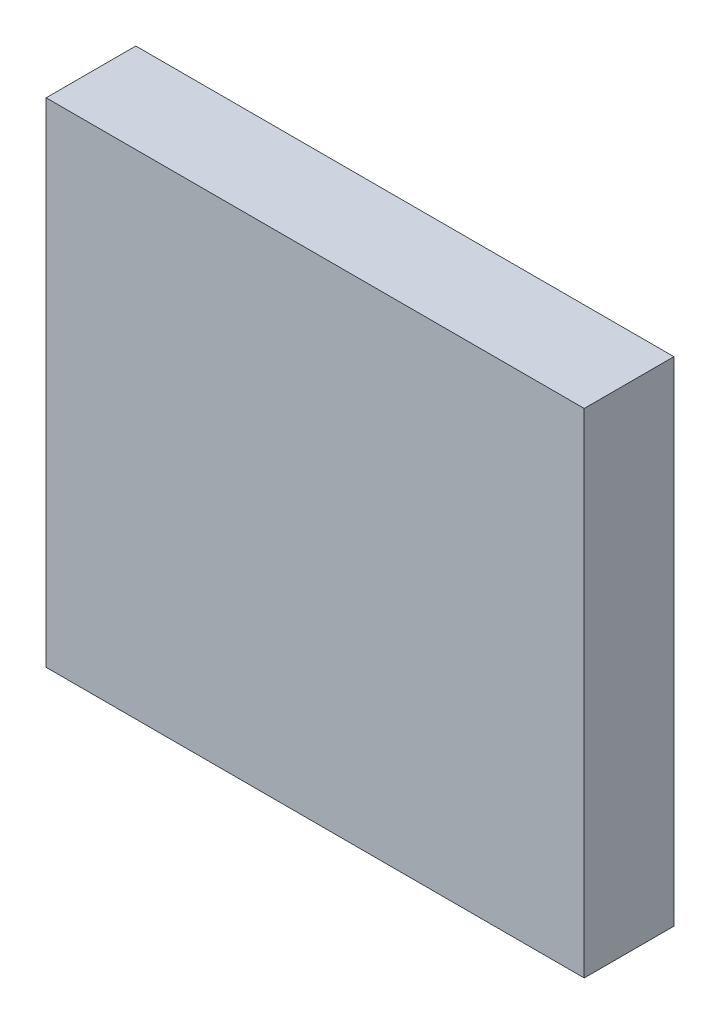
ISO-10303-21;
HEADER;
FILE_DESCRIPTION(('STEP AP214'),'2;1');
FILE_NAME('part.step','',(''),(''),'','','');
FILE_SCHEMA(('AUTOMOTIVE_DESIGN { 1 0 10303 214 1 1 1 1 }'));
ENDSEC;
DATA;
#1=APPLICATION_CONTEXT('core data for automotive mechanical design processes');
#2=APPLICATION_PROTOCOL_DEFINITION('international standard','automotive_design',2000,#1);
#3=PRODUCT_CONTEXT('',#1,'mechanical');
#4=PRODUCT('Part','Part','',(#3));
#5=PRODUCT_RELATED_PRODUCT_CATEGORY('part','',(#4));
#6=PRODUCT_DEFINITION_FORMATION('','',#4);
#7=PRODUCT_DEFINITION_CONTEXT('part definition',#1,'design');
#8=PRODUCT_DEFINITION('design','',#6,#7);
#9=PRODUCT_DEFINITION_SHAPE('','',#8);
#10=(LENGTH_UNIT() NAMED_UNIT(*) SI_UNIT(.MILLI.,.METRE.));
#11=(NAMED_UNIT(*) PLANE_ANGLE_UNIT() SI_UNIT($,.RADIAN.));
#12=(NAMED_UNIT(*) SI_UNIT($,.STERADIAN.) SOLID_ANGLE_UNIT());
#13=UNCERTAINTY_MEASURE_WITH_UNIT(LENGTH_MEASURE(1.E-05),#10,'distance_accuracy_value','');
#14=(GEOMETRIC_REPRESENTATION_CONTEXT(3) GLOBAL_UNCERTAINTY_ASSIGNED_CONTEXT((#13)) GLOBAL_UNIT_ASSIGNED_CONTEXT((#10,
#11,#12)) REPRESENTATION_CONTEXT('',''));
#15=CARTESIAN_POINT('',(0.,0.,0.));
#16=DIRECTION('',(0.,0.,1.));
#17=DIRECTION('',(1.,0.,0.));
#18=AXIS2_PLACEMENT_3D('',#15,#16,#17);
#19=CARTESIAN_POINT('',(-15.,13.75,5.));
#20=DIRECTION('',(1.,0.,0.));
#21=DIRECTION('',(0.,1.,0.));
#22=AXIS2_PLACEMENT_3D('',#19,#20,#21);
#23=PLANE('',#22);
#24=DIRECTION('',(0.,-1.,0.));
#25=VECTOR('',#24,1.);
#26=CARTESIAN_POINT('',(-15.,13.75,0.));
#27=LINE('',#26,#25);
#28=CARTESIAN_POINT('',(-15.,13.75,0.));
#29=VERTEX_POINT('',#28);
#30=CARTESIAN_POINT('',(-15.,-13.75,0.));
#31=VERTEX_POINT('',#30);
#32=EDGE_CURVE('E102',#29,#31,#27,.T.);
#33=ORIENTED_EDGE('',*,*,#32,.T.);
#34=DIRECTION('',(0.,0.,-1.));
#35=VECTOR('',#34,1.);
#36=CARTESIAN_POINT('',(-15.,-13.75,5.));
#37=LINE('',#36,#35);
#38=CARTESIAN_POINT('',(-15.,-13.75,5.));
#39=VERTEX_POINT('',#38);
#40=EDGE_CURVE('E11',#39,#31,#37,.T.);
#41=ORIENTED_EDGE('',*,*,#40,.F.);
#42=DIRECTION('',(0.,-1.,0.));
#43=VECTOR('',#42,1.);
#44=CARTESIAN_POINT('',(-15.,13.75,5.));
#45=LINE('',#44,#43);
#46=CARTESIAN_POINT('',(-15.,13.75,5.));
#47=VERTEX_POINT('',#46);
#48=EDGE_CURVE('E90',#47,#39,#45,.T.);
#49=ORIENTED_EDGE('',*,*,#48,.F.);
#50=DIRECTION('',(0.,0.,-1.));
#51=VECTOR('',#50,1.);
#52=CARTESIAN_POINT('',(-15.,13.75,5.));
#53=LINE('',#52,#51);
#54=EDGE_CURVE('E98',#47,#29,#53,.T.);
#55=ORIENTED_EDGE('',*,*,#54,.T.);
#56=EDGE_LOOP('',(#33,#41,#49,#55));
#57=FACE_BOUND('',#56,.T.);
#58=ADVANCED_FACE('F39',(#57),#23,.F.);
#59=CARTESIAN_POINT('',(15.,-13.75,5.));
#60=DIRECTION('',(0.,1.,0.));
#61=DIRECTION('',(-1.,0.,0.));
#62=AXIS2_PLACEMENT_3D('',#59,#60,#61);
#63=PLANE('',#62);
#64=DIRECTION('',(1.,0.,0.));
#65=VECTOR('',#64,1.);
#66=CARTESIAN_POINT('',(15.,-13.75,0.));
#67=LINE('',#66,#65);
#68=CARTESIAN_POINT('',(15.,-13.75,0.));
#69=VERTEX_POINT('',#68);
#70=EDGE_CURVE('E94',#31,#69,#67,.T.);
#71=ORIENTED_EDGE('',*,*,#70,.T.);
#72=DIRECTION('',(0.,0.,-1.));
#73=VECTOR('',#72,1.);
#74=CARTESIAN_POINT('',(15.,-13.75,5.));
#75=LINE('',#74,#73);
#76=CARTESIAN_POINT('',(15.,-13.75,5.));
#77=VERTEX_POINT('',#76);
#78=EDGE_CURVE('E47',#77,#69,#75,.T.);
#79=ORIENTED_EDGE('',*,*,#78,.F.);
#80=DIRECTION('',(1.,0.,0.));
#81=VECTOR('',#80,1.);
#82=CARTESIAN_POINT('',(15.,-13.75,5.));
#83=LINE('',#82,#81);
#84=EDGE_CURVE('E85',#39,#77,#83,.T.);
#85=ORIENTED_EDGE('',*,*,#84,.F.);
#86=ORIENTED_EDGE('',*,*,#40,.T.);
#87=EDGE_LOOP('',(#71,#79,#85,#86));
#88=FACE_BOUND('',#87,.T.);
#89=ADVANCED_FACE('F93',(#88),#63,.F.);
#90=CARTESIAN_POINT('',(15.,13.75,5.));
#91=DIRECTION('',(-1.,0.,0.));
#92=DIRECTION('',(0.,-1.,0.));
#93=AXIS2_PLACEMENT_3D('',#90,#91,#92);
#94=PLANE('',#93);
#95=DIRECTION('',(0.,1.,0.));
#96=VECTOR('',#95,1.);
#97=CARTESIAN_POINT('',(15.,13.75,0.));
#98=LINE('',#97,#96);
#99=CARTESIAN_POINT('',(15.,13.75,0.));
#100=VERTEX_POINT('',#99);
#101=EDGE_CURVE('E72',#69,#100,#98,.T.);
#102=ORIENTED_EDGE('',*,*,#101,.T.);
#103=DIRECTION('',(0.,0.,-1.));
#104=VECTOR('',#103,1.);
#105=CARTESIAN_POINT('',(15.,13.75,5.));
#106=LINE('',#105,#104);
#107=CARTESIAN_POINT('',(15.,13.75,5.));
#108=VERTEX_POINT('',#107);
#109=EDGE_CURVE('E95',#108,#100,#106,.T.);
#110=ORIENTED_EDGE('',*,*,#109,.F.);
#111=DIRECTION('',(0.,1.,0.));
#112=VECTOR('',#111,1.);
#113=CARTESIAN_POINT('',(15.,13.75,5.));
#114=LINE('',#113,#112);
#115=EDGE_CURVE('E88',#77,#108,#114,.T.);
#116=ORIENTED_EDGE('',*,*,#115,.F.);
#117=ORIENTED_EDGE('',*,*,#78,.T.);
#118=EDGE_LOOP('',(#102,#110,#116,#117));
#119=FACE_BOUND('',#118,.T.);
#120=ADVANCED_FACE('F96',(#119),#94,.F.);
#121=CARTESIAN_POINT('',(15.,13.75,5.));
#122=DIRECTION('',(0.,-1.,0.));
#123=DIRECTION('',(1.,0.,0.));
#124=AXIS2_PLACEMENT_3D('',#121,#122,#123);
#125=PLANE('',#124);
#126=DIRECTION('',(-1.,0.,0.));
#127=VECTOR('',#126,1.);
#128=CARTESIAN_POINT('',(15.,13.75,0.));
#129=LINE('',#128,#127);
#130=EDGE_CURVE('E78',#100,#29,#129,.T.);
#131=ORIENTED_EDGE('',*,*,#130,.T.);
#132=ORIENTED_EDGE('',*,*,#54,.F.);
#133=DIRECTION('',(-1.,0.,0.));
#134=VECTOR('',#133,1.);
#135=CARTESIAN_POINT('',(15.,13.75,5.));
#136=LINE('',#135,#134);
#137=EDGE_CURVE('E55',#108,#47,#136,.T.);
#138=ORIENTED_EDGE('',*,*,#137,.F.);
#139=ORIENTED_EDGE('',*,*,#109,.T.);
#140=EDGE_LOOP('',(#131,#132,#138,#139));
#141=FACE_BOUND('',#140,.T.);
#142=ADVANCED_FACE('F109',(#141),#125,.F.);
#143=CARTESIAN_POINT('',(0.,0.,5.));
#144=DIRECTION('',(0.,0.,-1.));
#145=DIRECTION('',(-1.,0.,0.));
#146=AXIS2_PLACEMENT_3D('',#143,#144,#145);
#147=PLANE('',#146);
#148=ORIENTED_EDGE('',*,*,#48,.T.);
#149=ORIENTED_EDGE('',*,*,#84,.T.);
#150=ORIENTED_EDGE('',*,*,#115,.T.);
#151=ORIENTED_EDGE('',*,*,#137,.T.);
#152=EDGE_LOOP('',(#148,#149,#150,#151));
#153=FACE_BOUND('',#152,.T.);
#154=ADVANCED_FACE('F86',(#153),#147,.F.);
#155=CARTESIAN_POINT('',(0.,0.,0.));
#156=DIRECTION('',(0.,0.,-1.));
#157=DIRECTION('',(-1.,0.,0.));
#158=AXIS2_PLACEMENT_3D('',#155,#156,#157);
#159=PLANE('',#158);
#160=ORIENTED_EDGE('',*,*,#32,.F.);
#161=ORIENTED_EDGE('',*,*,#130,.F.);
#162=ORIENTED_EDGE('',*,*,#101,.F.);
#163=ORIENTED_EDGE('',*,*,#70,.F.);
#164=EDGE_LOOP('',(#160,#161,#162,#163));
#165=FACE_BOUND('',#164,.T.);
#166=ADVANCED_FACE('F112',(#165),#159,.T.);
#167=CLOSED_SHELL('',(#58,#89,#120,#142,#154,#166));
#168=MANIFOLD_SOLID_BREP('B2',#167);
#169=ADVANCED_BREP_SHAPE_REPRESENTATION('',(#18,#168),#14);
#170=SHAPE_DEFINITION_REPRESENTATION(#9,#169);
ENDSEC;
END-ISO-10303-21;
